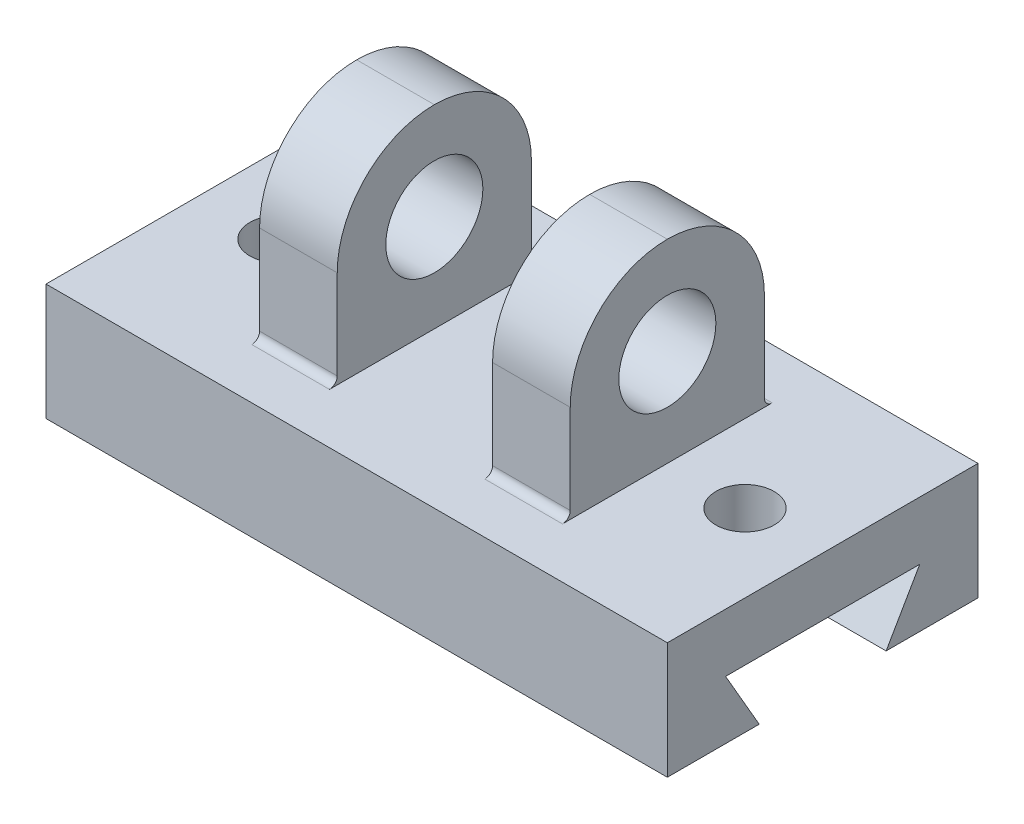
ISO-10303-21;
HEADER;
FILE_DESCRIPTION(('STEP AP214'),'2;1');
FILE_NAME('part.step','',(''),(''),'','','');
FILE_SCHEMA(('AUTOMOTIVE_DESIGN { 1 0 10303 214 1 1 1 1 }'));
ENDSEC;
DATA;
#1=APPLICATION_CONTEXT('core data for automotive mechanical design processes');
#2=APPLICATION_PROTOCOL_DEFINITION('international standard','automotive_design',2000,#1);
#3=PRODUCT_CONTEXT('',#1,'mechanical');
#4=PRODUCT('Part','Part','',(#3));
#5=PRODUCT_RELATED_PRODUCT_CATEGORY('part','',(#4));
#6=PRODUCT_DEFINITION_FORMATION('','',#4);
#7=PRODUCT_DEFINITION_CONTEXT('part definition',#1,'design');
#8=PRODUCT_DEFINITION('design','',#6,#7);
#9=PRODUCT_DEFINITION_SHAPE('','',#8);
#10=(LENGTH_UNIT() NAMED_UNIT(*) SI_UNIT(.MILLI.,.METRE.));
#11=(NAMED_UNIT(*) PLANE_ANGLE_UNIT() SI_UNIT($,.RADIAN.));
#12=(NAMED_UNIT(*) SI_UNIT($,.STERADIAN.) SOLID_ANGLE_UNIT());
#13=UNCERTAINTY_MEASURE_WITH_UNIT(LENGTH_MEASURE(1.E-05),#10,'distance_accuracy_value','');
#14=(GEOMETRIC_REPRESENTATION_CONTEXT(3) GLOBAL_UNCERTAINTY_ASSIGNED_CONTEXT((#13)) GLOBAL_UNIT_ASSIGNED_CONTEXT((#10,
#11,#12)) REPRESENTATION_CONTEXT('',''));
#15=CARTESIAN_POINT('',(0.,0.,0.));
#16=DIRECTION('',(0.,0.,1.));
#17=DIRECTION('',(1.,0.,0.));
#18=AXIS2_PLACEMENT_3D('',#15,#16,#17);
#19=CARTESIAN_POINT('',(80.,0.,0.));
#20=DIRECTION('',(0.,-1.,0.));
#21=DIRECTION('',(0.,0.,-1.));
#22=AXIS2_PLACEMENT_3D('',#19,#20,#21);
#23=PLANE('',#22);
#24=CARTESIAN_POINT('',(-60.,0.,40.));
#25=DIRECTION('',(0.,-1.,0.));
#26=DIRECTION('',(0.,0.,1.));
#27=AXIS2_PLACEMENT_3D('',#24,#25,#26);
#28=CIRCLE('',#27,7.50000000000001);
#29=CARTESIAN_POINT('',(-60.,0.,47.5));
#30=VERTEX_POINT('',#29);
#31=EDGE_CURVE('E353',#30,#30,#28,.T.);
#32=ORIENTED_EDGE('',*,*,#31,.T.);
#33=EDGE_LOOP('',(#32));
#34=FACE_BOUND('',#33,.T.);
#35=DIRECTION('',(1.,0.,0.));
#36=VECTOR('',#35,1.);
#37=CARTESIAN_POINT('',(80.,0.,13.));
#38=LINE('',#37,#36);
#39=CARTESIAN_POINT('',(-40.,0.,13.));
#40=VERTEX_POINT('',#39);
#41=CARTESIAN_POINT('',(-20.,0.,13.));
#42=VERTEX_POINT('',#41);
#43=EDGE_CURVE('E363',#40,#42,#38,.T.);
#44=ORIENTED_EDGE('',*,*,#43,.T.);
#45=DIRECTION('',(0.,0.,1.));
#46=VECTOR('',#45,1.);
#47=CARTESIAN_POINT('',(-20.,0.,65.));
#48=LINE('',#47,#46);
#49=CARTESIAN_POINT('',(-20.,0.,67.));
#50=VERTEX_POINT('',#49);
#51=EDGE_CURVE('E369',#42,#50,#48,.T.);
#52=ORIENTED_EDGE('',*,*,#51,.T.);
#53=DIRECTION('',(-1.,0.,0.));
#54=VECTOR('',#53,1.);
#55=CARTESIAN_POINT('',(80.,0.,67.));
#56=LINE('',#55,#54);
#57=CARTESIAN_POINT('',(-40.,0.,67.));
#58=VERTEX_POINT('',#57);
#59=EDGE_CURVE('E341',#50,#58,#56,.T.);
#60=ORIENTED_EDGE('',*,*,#59,.T.);
#61=DIRECTION('',(0.,0.,-1.));
#62=VECTOR('',#61,1.);
#63=CARTESIAN_POINT('',(-40.,0.,15.));
#64=LINE('',#63,#62);
#65=EDGE_CURVE('E345',#58,#40,#64,.T.);
#66=ORIENTED_EDGE('',*,*,#65,.T.);
#67=EDGE_LOOP('',(#44,#52,#60,#66));
#68=FACE_BOUND('',#67,.T.);
#69=CARTESIAN_POINT('',(60.,0.,40.));
#70=DIRECTION('',(0.,1.,0.));
#71=DIRECTION('',(0.,0.,1.));
#72=AXIS2_PLACEMENT_3D('',#69,#70,#71);
#73=CIRCLE('',#72,7.50000000000001);
#74=CARTESIAN_POINT('',(60.,0.,47.5));
#75=VERTEX_POINT('',#74);
#76=EDGE_CURVE('E235',#75,#75,#73,.T.);
#77=ORIENTED_EDGE('',*,*,#76,.F.);
#78=EDGE_LOOP('',(#77));
#79=FACE_BOUND('',#78,.T.);
#80=DIRECTION('',(-1.,0.,0.));
#81=VECTOR('',#80,1.);
#82=CARTESIAN_POINT('',(80.,0.,0.));
#83=LINE('',#82,#81);
#84=CARTESIAN_POINT('',(80.,0.,0.));
#85=VERTEX_POINT('',#84);
#86=CARTESIAN_POINT('',(-80.,0.,0.));
#87=VERTEX_POINT('',#86);
#88=EDGE_CURVE('E287',#85,#87,#83,.T.);
#89=ORIENTED_EDGE('',*,*,#88,.T.);
#90=DIRECTION('',(0.,0.,1.));
#91=VECTOR('',#90,1.);
#92=CARTESIAN_POINT('',(-80.,0.,0.));
#93=LINE('',#92,#91);
#94=CARTESIAN_POINT('',(-80.,0.,80.));
#95=VERTEX_POINT('',#94);
#96=EDGE_CURVE('E212',#87,#95,#93,.T.);
#97=ORIENTED_EDGE('',*,*,#96,.T.);
#98=DIRECTION('',(-1.,0.,0.));
#99=VECTOR('',#98,1.);
#100=CARTESIAN_POINT('',(80.,0.,80.));
#101=LINE('',#100,#99);
#102=CARTESIAN_POINT('',(80.,0.,80.));
#103=VERTEX_POINT('',#102);
#104=EDGE_CURVE('E285',#103,#95,#101,.T.);
#105=ORIENTED_EDGE('',*,*,#104,.F.);
#106=DIRECTION('',(0.,0.,1.));
#107=VECTOR('',#106,1.);
#108=CARTESIAN_POINT('',(80.,0.,0.));
#109=LINE('',#108,#107);
#110=EDGE_CURVE('E263',#85,#103,#109,.T.);
#111=ORIENTED_EDGE('',*,*,#110,.F.);
#112=EDGE_LOOP('',(#89,#97,#105,#111));
#113=FACE_BOUND('',#112,.T.);
#114=DIRECTION('',(0.,0.,1.));
#115=VECTOR('',#114,1.);
#116=CARTESIAN_POINT('',(20.,0.,65.));
#117=LINE('',#116,#115);
#118=CARTESIAN_POINT('',(20.,0.,13.));
#119=VERTEX_POINT('',#118);
#120=CARTESIAN_POINT('',(20.,0.,67.));
#121=VERTEX_POINT('',#120);
#122=EDGE_CURVE('E246',#119,#121,#117,.T.);
#123=ORIENTED_EDGE('',*,*,#122,.F.);
#124=DIRECTION('',(-1.,0.,0.));
#125=VECTOR('',#124,1.);
#126=CARTESIAN_POINT('',(40.,0.,13.));
#127=LINE('',#126,#125);
#128=CARTESIAN_POINT('',(40.,0.,13.));
#129=VERTEX_POINT('',#128);
#130=EDGE_CURVE('E320',#119,#129,#127,.F.);
#131=ORIENTED_EDGE('',*,*,#130,.T.);
#132=DIRECTION('',(0.,0.,-1.));
#133=VECTOR('',#132,1.);
#134=CARTESIAN_POINT('',(40.,0.,15.));
#135=LINE('',#134,#133);
#136=CARTESIAN_POINT('',(40.,0.,67.));
#137=VERTEX_POINT('',#136);
#138=EDGE_CURVE('E248',#137,#129,#135,.T.);
#139=ORIENTED_EDGE('',*,*,#138,.F.);
#140=DIRECTION('',(1.,0.,0.));
#141=VECTOR('',#140,1.);
#142=CARTESIAN_POINT('',(20.,0.,67.));
#143=LINE('',#142,#141);
#144=EDGE_CURVE('E309',#137,#121,#143,.F.);
#145=ORIENTED_EDGE('',*,*,#144,.T.);
#146=EDGE_LOOP('',(#123,#131,#139,#145));
#147=FACE_BOUND('',#146,.T.);
#148=ADVANCED_FACE('F39',(#34,#68,#79,#113,#147),#23,.F.);
#149=CARTESIAN_POINT('',(80.,-30.,0.));
#150=DIRECTION('',(0.,0.,1.));
#151=DIRECTION('',(1.,0.,0.));
#152=AXIS2_PLACEMENT_3D('',#149,#150,#151);
#153=PLANE('',#152);
#154=DIRECTION('',(-1.,0.,0.));
#155=VECTOR('',#154,1.);
#156=CARTESIAN_POINT('',(80.,-30.,0.));
#157=LINE('',#156,#155);
#158=CARTESIAN_POINT('',(80.,-30.,0.));
#159=VERTEX_POINT('',#158);
#160=CARTESIAN_POINT('',(-80.,-30.,0.));
#161=VERTEX_POINT('',#160);
#162=EDGE_CURVE('E190',#159,#161,#157,.T.);
#163=ORIENTED_EDGE('',*,*,#162,.T.);
#164=DIRECTION('',(0.,1.,0.));
#165=VECTOR('',#164,1.);
#166=CARTESIAN_POINT('',(-80.,-30.,0.));
#167=LINE('',#166,#165);
#168=EDGE_CURVE('E194',#161,#87,#167,.T.);
#169=ORIENTED_EDGE('',*,*,#168,.T.);
#170=ORIENTED_EDGE('',*,*,#88,.F.);
#171=DIRECTION('',(0.,1.,0.));
#172=VECTOR('',#171,1.);
#173=CARTESIAN_POINT('',(80.,-30.,0.));
#174=LINE('',#173,#172);
#175=EDGE_CURVE('E197',#159,#85,#174,.T.);
#176=ORIENTED_EDGE('',*,*,#175,.F.);
#177=EDGE_LOOP('',(#163,#169,#170,#176));
#178=FACE_BOUND('',#177,.T.);
#179=ADVANCED_FACE('F192',(#178),#153,.F.);
#180=CARTESIAN_POINT('',(80.,0.,80.));
#181=DIRECTION('',(0.,0.,-1.));
#182=DIRECTION('',(-1.,0.,0.));
#183=AXIS2_PLACEMENT_3D('',#180,#181,#182);
#184=PLANE('',#183);
#185=ORIENTED_EDGE('',*,*,#104,.T.);
#186=DIRECTION('',(0.,-1.,0.));
#187=VECTOR('',#186,1.);
#188=CARTESIAN_POINT('',(-80.,0.,80.));
#189=LINE('',#188,#187);
#190=CARTESIAN_POINT('',(-80.,-30.,80.));
#191=VERTEX_POINT('',#190);
#192=EDGE_CURVE('E231',#95,#191,#189,.T.);
#193=ORIENTED_EDGE('',*,*,#192,.T.);
#194=DIRECTION('',(-1.,0.,0.));
#195=VECTOR('',#194,1.);
#196=CARTESIAN_POINT('',(80.,-30.,80.));
#197=LINE('',#196,#195);
#198=CARTESIAN_POINT('',(80.,-30.,80.));
#199=VERTEX_POINT('',#198);
#200=EDGE_CURVE('E283',#199,#191,#197,.T.);
#201=ORIENTED_EDGE('',*,*,#200,.F.);
#202=DIRECTION('',(0.,-1.,0.));
#203=VECTOR('',#202,1.);
#204=CARTESIAN_POINT('',(80.,0.,80.));
#205=LINE('',#204,#203);
#206=EDGE_CURVE('E265',#103,#199,#205,.T.);
#207=ORIENTED_EDGE('',*,*,#206,.F.);
#208=EDGE_LOOP('',(#185,#193,#201,#207));
#209=FACE_BOUND('',#208,.T.);
#210=ADVANCED_FACE('F425',(#209),#184,.F.);
#211=CARTESIAN_POINT('',(80.,-30.,80.));
#212=DIRECTION('',(0.,1.,0.));
#213=DIRECTION('',(0.,0.,1.));
#214=AXIS2_PLACEMENT_3D('',#211,#212,#213);
#215=PLANE('',#214);
#216=ORIENTED_EDGE('',*,*,#200,.T.);
#217=DIRECTION('',(0.,0.,-1.));
#218=VECTOR('',#217,1.);
#219=CARTESIAN_POINT('',(-80.,-30.,80.));
#220=LINE('',#219,#218);
#221=CARTESIAN_POINT('',(-80.,-30.,56.3397459621555));
#222=VERTEX_POINT('',#221);
#223=EDGE_CURVE('E228',#191,#222,#220,.T.);
#224=ORIENTED_EDGE('',*,*,#223,.T.);
#225=DIRECTION('',(-1.,0.,0.));
#226=VECTOR('',#225,1.);
#227=CARTESIAN_POINT('',(80.,-30.,56.3397459621555));
#228=LINE('',#227,#226);
#229=CARTESIAN_POINT('',(80.,-30.,56.3397459621555));
#230=VERTEX_POINT('',#229);
#231=EDGE_CURVE('E281',#230,#222,#228,.T.);
#232=ORIENTED_EDGE('',*,*,#231,.F.);
#233=DIRECTION('',(0.,0.,-1.));
#234=VECTOR('',#233,1.);
#235=CARTESIAN_POINT('',(80.,-30.,80.));
#236=LINE('',#235,#234);
#237=EDGE_CURVE('E267',#199,#230,#236,.T.);
#238=ORIENTED_EDGE('',*,*,#237,.F.);
#239=EDGE_LOOP('',(#216,#224,#232,#238));
#240=FACE_BOUND('',#239,.T.);
#241=ADVANCED_FACE('F422',(#240),#215,.F.);
#242=CARTESIAN_POINT('',(80.,-30.,56.3397459621555));
#243=DIRECTION('',(0.,-0.500000000000004,0.866025403784436));
#244=DIRECTION('',(0.,-0.866025403784436,-0.500000000000004));
#245=AXIS2_PLACEMENT_3D('',#242,#243,#244);
#246=PLANE('',#245);
#247=ORIENTED_EDGE('',*,*,#231,.T.);
#248=DIRECTION('',(0.,0.866025403784436,0.500000000000004));
#249=VECTOR('',#248,1.);
#250=CARTESIAN_POINT('',(-80.,-30.,56.3397459621555));
#251=LINE('',#250,#249);
#252=CARTESIAN_POINT('',(-80.,-15.,65.));
#253=VERTEX_POINT('',#252);
#254=EDGE_CURVE('E225',#222,#253,#251,.T.);
#255=ORIENTED_EDGE('',*,*,#254,.T.);
#256=DIRECTION('',(-1.,0.,0.));
#257=VECTOR('',#256,1.);
#258=CARTESIAN_POINT('',(80.,-15.,65.));
#259=LINE('',#258,#257);
#260=CARTESIAN_POINT('',(80.,-15.,65.));
#261=VERTEX_POINT('',#260);
#262=EDGE_CURVE('E279',#261,#253,#259,.T.);
#263=ORIENTED_EDGE('',*,*,#262,.F.);
#264=DIRECTION('',(0.,0.866025403784436,0.500000000000004));
#265=VECTOR('',#264,1.);
#266=CARTESIAN_POINT('',(80.,-30.,56.3397459621555));
#267=LINE('',#266,#265);
#268=EDGE_CURVE('E269',#230,#261,#267,.T.);
#269=ORIENTED_EDGE('',*,*,#268,.F.);
#270=EDGE_LOOP('',(#247,#255,#263,#269));
#271=FACE_BOUND('',#270,.T.);
#272=ADVANCED_FACE('F407',(#271),#246,.F.);
#273=CARTESIAN_POINT('',(80.,-15.,65.));
#274=DIRECTION('',(0.,1.,0.));
#275=DIRECTION('',(0.,0.,1.));
#276=AXIS2_PLACEMENT_3D('',#273,#274,#275);
#277=PLANE('',#276);
#278=CARTESIAN_POINT('',(-60.,-15.,40.));
#279=DIRECTION('',(0.,1.,0.));
#280=DIRECTION('',(0.,0.,1.));
#281=AXIS2_PLACEMENT_3D('',#278,#279,#280);
#282=CIRCLE('',#281,7.50000000000001);
#283=CARTESIAN_POINT('',(-60.,-15.,47.5));
#284=VERTEX_POINT('',#283);
#285=EDGE_CURVE('E350',#284,#284,#282,.F.);
#286=ORIENTED_EDGE('',*,*,#285,.F.);
#287=EDGE_LOOP('',(#286));
#288=FACE_BOUND('',#287,.T.);
#289=CARTESIAN_POINT('',(60.,-15.,40.));
#290=DIRECTION('',(0.,1.,0.));
#291=DIRECTION('',(0.,0.,1.));
#292=AXIS2_PLACEMENT_3D('',#289,#290,#291);
#293=CIRCLE('',#292,7.50000000000001);
#294=CARTESIAN_POINT('',(60.,-15.,47.5));
#295=VERTEX_POINT('',#294);
#296=EDGE_CURVE('E238',#295,#295,#293,.T.);
#297=ORIENTED_EDGE('',*,*,#296,.T.);
#298=EDGE_LOOP('',(#297));
#299=FACE_BOUND('',#298,.T.);
#300=ORIENTED_EDGE('',*,*,#262,.T.);
#301=DIRECTION('',(0.,0.,-1.));
#302=VECTOR('',#301,1.);
#303=CARTESIAN_POINT('',(-80.,-15.,65.));
#304=LINE('',#303,#302);
#305=CARTESIAN_POINT('',(-80.,-15.,15.));
#306=VERTEX_POINT('',#305);
#307=EDGE_CURVE('E219',#253,#306,#304,.T.);
#308=ORIENTED_EDGE('',*,*,#307,.T.);
#309=DIRECTION('',(-1.,0.,0.));
#310=VECTOR('',#309,1.);
#311=CARTESIAN_POINT('',(80.,-15.,15.));
#312=LINE('',#311,#310);
#313=CARTESIAN_POINT('',(80.,-15.,15.));
#314=VERTEX_POINT('',#313);
#315=EDGE_CURVE('E277',#314,#306,#312,.T.);
#316=ORIENTED_EDGE('',*,*,#315,.F.);
#317=DIRECTION('',(0.,0.,-1.));
#318=VECTOR('',#317,1.);
#319=CARTESIAN_POINT('',(80.,-15.,65.));
#320=LINE('',#319,#318);
#321=EDGE_CURVE('E271',#261,#314,#320,.T.);
#322=ORIENTED_EDGE('',*,*,#321,.F.);
#323=EDGE_LOOP('',(#300,#308,#316,#322));
#324=FACE_BOUND('',#323,.T.);
#325=ADVANCED_FACE('F403',(#288,#299,#324),#277,.F.);
#326=CARTESIAN_POINT('',(80.,-15.,15.));
#327=DIRECTION('',(0.,-0.500000000000004,-0.866025403784436));
#328=DIRECTION('',(0.,0.866025403784436,-0.500000000000004));
#329=AXIS2_PLACEMENT_3D('',#326,#327,#328);
#330=PLANE('',#329);
#331=ORIENTED_EDGE('',*,*,#315,.T.);
#332=DIRECTION('',(0.,-0.866025403784436,0.500000000000004));
#333=VECTOR('',#332,1.);
#334=CARTESIAN_POINT('',(-80.,-15.,15.));
#335=LINE('',#334,#333);
#336=CARTESIAN_POINT('',(-80.,-30.,23.6602540378445));
#337=VERTEX_POINT('',#336);
#338=EDGE_CURVE('E217',#306,#337,#335,.T.);
#339=ORIENTED_EDGE('',*,*,#338,.T.);
#340=DIRECTION('',(-1.,0.,0.));
#341=VECTOR('',#340,1.);
#342=CARTESIAN_POINT('',(80.,-30.,23.6602540378445));
#343=LINE('',#342,#341);
#344=CARTESIAN_POINT('',(80.,-30.,23.6602540378445));
#345=VERTEX_POINT('',#344);
#346=EDGE_CURVE('E201',#345,#337,#343,.T.);
#347=ORIENTED_EDGE('',*,*,#346,.F.);
#348=DIRECTION('',(0.,-0.866025403784436,0.500000000000004));
#349=VECTOR('',#348,1.);
#350=CARTESIAN_POINT('',(80.,-15.,15.));
#351=LINE('',#350,#349);
#352=EDGE_CURVE('E273',#314,#345,#351,.T.);
#353=ORIENTED_EDGE('',*,*,#352,.F.);
#354=EDGE_LOOP('',(#331,#339,#347,#353));
#355=FACE_BOUND('',#354,.T.);
#356=ADVANCED_FACE('F406',(#355),#330,.F.);
#357=CARTESIAN_POINT('',(80.,-30.,23.6602540378445));
#358=DIRECTION('',(0.,1.,0.));
#359=DIRECTION('',(0.,0.,1.));
#360=AXIS2_PLACEMENT_3D('',#357,#358,#359);
#361=PLANE('',#360);
#362=ORIENTED_EDGE('',*,*,#346,.T.);
#363=DIRECTION('',(0.,0.,-1.));
#364=VECTOR('',#363,1.);
#365=CARTESIAN_POINT('',(-80.,-30.,23.6602540378445));
#366=LINE('',#365,#364);
#367=EDGE_CURVE('E208',#337,#161,#366,.T.);
#368=ORIENTED_EDGE('',*,*,#367,.T.);
#369=ORIENTED_EDGE('',*,*,#162,.F.);
#370=DIRECTION('',(0.,0.,-1.));
#371=VECTOR('',#370,1.);
#372=CARTESIAN_POINT('',(80.,-30.,23.6602540378445));
#373=LINE('',#372,#371);
#374=EDGE_CURVE('E202',#345,#159,#373,.T.);
#375=ORIENTED_EDGE('',*,*,#374,.F.);
#376=EDGE_LOOP('',(#362,#368,#369,#375));
#377=FACE_BOUND('',#376,.T.);
#378=ADVANCED_FACE('F215',(#377),#361,.F.);
#379=CARTESIAN_POINT('',(80.,0.,0.));
#380=DIRECTION('',(1.,0.,0.));
#381=DIRECTION('',(0.,0.,-1.));
#382=AXIS2_PLACEMENT_3D('',#379,#380,#381);
#383=PLANE('',#382);
#384=ORIENTED_EDGE('',*,*,#175,.T.);
#385=ORIENTED_EDGE('',*,*,#110,.T.);
#386=ORIENTED_EDGE('',*,*,#206,.T.);
#387=ORIENTED_EDGE('',*,*,#237,.T.);
#388=ORIENTED_EDGE('',*,*,#268,.T.);
#389=ORIENTED_EDGE('',*,*,#321,.T.);
#390=ORIENTED_EDGE('',*,*,#352,.T.);
#391=ORIENTED_EDGE('',*,*,#374,.T.);
#392=EDGE_LOOP('',(#384,#385,#386,#387,#388,#389,#390,#391));
#393=FACE_BOUND('',#392,.T.);
#394=ADVANCED_FACE('F431',(#393),#383,.T.);
#395=CARTESIAN_POINT('',(20.,50.,15.));
#396=DIRECTION('',(0.,0.,1.));
#397=DIRECTION('',(1.,0.,0.));
#398=AXIS2_PLACEMENT_3D('',#395,#396,#397);
#399=PLANE('',#398);
#400=DIRECTION('',(0.,-1.,0.));
#401=VECTOR('',#400,1.);
#402=CARTESIAN_POINT('',(40.,50.,15.));
#403=LINE('',#402,#401);
#404=CARTESIAN_POINT('',(40.,25.,15.));
#405=VERTEX_POINT('',#404);
#406=CARTESIAN_POINT('',(40.,2.,15.));
#407=VERTEX_POINT('',#406);
#408=EDGE_CURVE('E250',#405,#407,#403,.T.);
#409=ORIENTED_EDGE('',*,*,#408,.T.);
#410=DIRECTION('',(-1.,0.,0.));
#411=VECTOR('',#410,1.);
#412=CARTESIAN_POINT('',(20.,2.,15.));
#413=LINE('',#412,#411);
#414=CARTESIAN_POINT('',(20.,2.,15.));
#415=VERTEX_POINT('',#414);
#416=EDGE_CURVE('E317',#407,#415,#413,.T.);
#417=ORIENTED_EDGE('',*,*,#416,.T.);
#418=DIRECTION('',(0.,-1.,0.));
#419=VECTOR('',#418,1.);
#420=CARTESIAN_POINT('',(20.,50.,15.));
#421=LINE('',#420,#419);
#422=CARTESIAN_POINT('',(20.,25.,15.));
#423=VERTEX_POINT('',#422);
#424=EDGE_CURVE('E259',#423,#415,#421,.T.);
#425=ORIENTED_EDGE('',*,*,#424,.F.);
#426=DIRECTION('',(-1.,0.,0.));
#427=VECTOR('',#426,1.);
#428=CARTESIAN_POINT('',(20.,25.,15.));
#429=LINE('',#428,#427);
#430=EDGE_CURVE('E300',#423,#405,#429,.F.);
#431=ORIENTED_EDGE('',*,*,#430,.T.);
#432=EDGE_LOOP('',(#409,#417,#425,#431));
#433=FACE_BOUND('',#432,.T.);
#434=ADVANCED_FACE('F519',(#433),#399,.F.);
#435=CARTESIAN_POINT('',(20.,50.,65.));
#436=DIRECTION('',(1.,0.,0.));
#437=DIRECTION('',(0.,0.,-1.));
#438=AXIS2_PLACEMENT_3D('',#435,#436,#437);
#439=PLANE('',#438);
#440=CARTESIAN_POINT('',(20.,25.,40.));
#441=DIRECTION('',(1.,0.,0.));
#442=DIRECTION('',(0.,0.,-1.));
#443=AXIS2_PLACEMENT_3D('',#440,#441,#442);
#444=CIRCLE('',#443,12.5);
#445=CARTESIAN_POINT('',(20.,25.,27.5));
#446=VERTEX_POINT('',#445);
#447=EDGE_CURVE('E242',#446,#446,#444,.T.);
#448=ORIENTED_EDGE('',*,*,#447,.T.);
#449=EDGE_LOOP('',(#448));
#450=FACE_BOUND('',#449,.T.);
#451=DIRECTION('',(0.,-1.,0.));
#452=VECTOR('',#451,1.);
#453=CARTESIAN_POINT('',(20.,50.,65.));
#454=LINE('',#453,#452);
#455=CARTESIAN_POINT('',(20.,25.,65.));
#456=VERTEX_POINT('',#455);
#457=CARTESIAN_POINT('',(20.,2.,65.));
#458=VERTEX_POINT('',#457);
#459=EDGE_CURVE('E256',#456,#458,#454,.T.);
#460=ORIENTED_EDGE('',*,*,#459,.F.);
#461=CARTESIAN_POINT('',(20.,25.,40.));
#462=DIRECTION('',(1.,0.,0.));
#463=DIRECTION('',(0.,0.,-1.));
#464=AXIS2_PLACEMENT_3D('',#461,#462,#463);
#465=CIRCLE('',#464,25.);
#466=CARTESIAN_POINT('',(20.,50.,40.));
#467=VERTEX_POINT('',#466);
#468=EDGE_CURVE('E298',#456,#467,#465,.F.);
#469=ORIENTED_EDGE('',*,*,#468,.T.);
#470=CARTESIAN_POINT('',(20.,25.,40.));
#471=DIRECTION('',(1.,0.,0.));
#472=DIRECTION('',(0.,0.,-1.));
#473=AXIS2_PLACEMENT_3D('',#470,#471,#472);
#474=CIRCLE('',#473,25.);
#475=EDGE_CURVE('E296',#467,#423,#474,.F.);
#476=ORIENTED_EDGE('',*,*,#475,.T.);
#477=ORIENTED_EDGE('',*,*,#424,.T.);
#478=CARTESIAN_POINT('',(20.,2.,13.));
#479=DIRECTION('',(1.,0.,0.));
#480=DIRECTION('',(0.,0.,-1.));
#481=AXIS2_PLACEMENT_3D('',#478,#479,#480);
#482=CIRCLE('',#481,2.);
#483=EDGE_CURVE('E323',#415,#119,#482,.T.);
#484=ORIENTED_EDGE('',*,*,#483,.T.);
#485=ORIENTED_EDGE('',*,*,#122,.T.);
#486=CARTESIAN_POINT('',(20.,2.,67.));
#487=DIRECTION('',(1.,0.,0.));
#488=DIRECTION('',(0.,0.,-1.));
#489=AXIS2_PLACEMENT_3D('',#486,#487,#488);
#490=CIRCLE('',#489,2.);
#491=EDGE_CURVE('E315',#121,#458,#490,.T.);
#492=ORIENTED_EDGE('',*,*,#491,.T.);
#493=EDGE_LOOP('',(#460,#469,#476,#477,#484,#485,#492));
#494=FACE_BOUND('',#493,.T.);
#495=ADVANCED_FACE('F515',(#450,#494),#439,.F.);
#496=CARTESIAN_POINT('',(40.,50.,65.));
#497=DIRECTION('',(0.,0.,-1.));
#498=DIRECTION('',(-1.,0.,0.));
#499=AXIS2_PLACEMENT_3D('',#496,#497,#498);
#500=PLANE('',#499);
#501=ORIENTED_EDGE('',*,*,#459,.T.);
#502=DIRECTION('',(1.,0.,0.));
#503=VECTOR('',#502,1.);
#504=CARTESIAN_POINT('',(40.,2.,65.));
#505=LINE('',#504,#503);
#506=CARTESIAN_POINT('',(40.,2.,65.));
#507=VERTEX_POINT('',#506);
#508=EDGE_CURVE('E302',#458,#507,#505,.T.);
#509=ORIENTED_EDGE('',*,*,#508,.T.);
#510=DIRECTION('',(0.,-1.,0.));
#511=VECTOR('',#510,1.);
#512=CARTESIAN_POINT('',(40.,50.,65.));
#513=LINE('',#512,#511);
#514=CARTESIAN_POINT('',(40.,25.,65.));
#515=VERTEX_POINT('',#514);
#516=EDGE_CURVE('E253',#515,#507,#513,.T.);
#517=ORIENTED_EDGE('',*,*,#516,.F.);
#518=DIRECTION('',(1.,0.,0.));
#519=VECTOR('',#518,1.);
#520=CARTESIAN_POINT('',(40.,25.,65.));
#521=LINE('',#520,#519);
#522=EDGE_CURVE('E293',#515,#456,#521,.F.);
#523=ORIENTED_EDGE('',*,*,#522,.T.);
#524=EDGE_LOOP('',(#501,#509,#517,#523));
#525=FACE_BOUND('',#524,.T.);
#526=ADVANCED_FACE('F511',(#525),#500,.F.);
#527=CARTESIAN_POINT('',(40.,50.,15.));
#528=DIRECTION('',(-1.,0.,0.));
#529=DIRECTION('',(0.,0.,1.));
#530=AXIS2_PLACEMENT_3D('',#527,#528,#529);
#531=PLANE('',#530);
#532=CARTESIAN_POINT('',(40.,25.,40.));
#533=DIRECTION('',(1.,0.,0.));
#534=DIRECTION('',(0.,0.,-1.));
#535=AXIS2_PLACEMENT_3D('',#532,#533,#534);
#536=CIRCLE('',#535,12.5);
#537=CARTESIAN_POINT('',(40.,25.,27.5));
#538=VERTEX_POINT('',#537);
#539=EDGE_CURVE('E239',#538,#538,#536,.T.);
#540=ORIENTED_EDGE('',*,*,#539,.F.);
#541=EDGE_LOOP('',(#540));
#542=FACE_BOUND('',#541,.T.);
#543=CARTESIAN_POINT('',(40.,25.,40.));
#544=DIRECTION('',(-1.,0.,0.));
#545=DIRECTION('',(0.,0.,1.));
#546=AXIS2_PLACEMENT_3D('',#543,#544,#545);
#547=CIRCLE('',#546,25.);
#548=CARTESIAN_POINT('',(40.,50.,40.));
#549=VERTEX_POINT('',#548);
#550=EDGE_CURVE('E289',#405,#549,#547,.F.);
#551=ORIENTED_EDGE('',*,*,#550,.T.);
#552=CARTESIAN_POINT('',(40.,25.,40.));
#553=DIRECTION('',(-1.,0.,0.));
#554=DIRECTION('',(0.,0.,1.));
#555=AXIS2_PLACEMENT_3D('',#552,#553,#554);
#556=CIRCLE('',#555,25.);
#557=EDGE_CURVE('E291',#549,#515,#556,.F.);
#558=ORIENTED_EDGE('',*,*,#557,.T.);
#559=ORIENTED_EDGE('',*,*,#516,.T.);
#560=CARTESIAN_POINT('',(40.,2.,67.));
#561=DIRECTION('',(-1.,0.,0.));
#562=DIRECTION('',(0.,0.,1.));
#563=AXIS2_PLACEMENT_3D('',#560,#561,#562);
#564=CIRCLE('',#563,2.);
#565=EDGE_CURVE('E312',#507,#137,#564,.T.);
#566=ORIENTED_EDGE('',*,*,#565,.T.);
#567=ORIENTED_EDGE('',*,*,#138,.T.);
#568=CARTESIAN_POINT('',(40.,2.,13.));
#569=DIRECTION('',(-1.,0.,0.));
#570=DIRECTION('',(0.,0.,1.));
#571=AXIS2_PLACEMENT_3D('',#568,#569,#570);
#572=CIRCLE('',#571,2.);
#573=EDGE_CURVE('E326',#129,#407,#572,.T.);
#574=ORIENTED_EDGE('',*,*,#573,.T.);
#575=ORIENTED_EDGE('',*,*,#408,.F.);
#576=EDGE_LOOP('',(#551,#558,#559,#566,#567,#574,#575));
#577=FACE_BOUND('',#576,.T.);
#578=ADVANCED_FACE('F458',(#542,#577),#531,.F.);
#579=CARTESIAN_POINT('',(0.,25.,40.));
#580=DIRECTION('',(-1.,0.,0.));
#581=DIRECTION('',(0.,0.,1.));
#582=AXIS2_PLACEMENT_3D('',#579,#580,#581);
#583=CYLINDRICAL_SURFACE('',#582,25.);
#584=ORIENTED_EDGE('',*,*,#430,.F.);
#585=ORIENTED_EDGE('',*,*,#475,.F.);
#586=DIRECTION('',(-1.,0.,0.));
#587=VECTOR('',#586,1.);
#588=CARTESIAN_POINT('',(0.,50.,40.));
#589=LINE('',#588,#587);
#590=EDGE_CURVE('E245',#549,#467,#589,.T.);
#591=ORIENTED_EDGE('',*,*,#590,.F.);
#592=ORIENTED_EDGE('',*,*,#550,.F.);
#593=EDGE_LOOP('',(#584,#585,#591,#592));
#594=FACE_BOUND('',#593,.T.);
#595=ADVANCED_FACE('F454',(#594),#583,.T.);
#596=CARTESIAN_POINT('',(0.,25.,40.));
#597=DIRECTION('',(1.,0.,0.));
#598=DIRECTION('',(0.,0.,-1.));
#599=AXIS2_PLACEMENT_3D('',#596,#597,#598);
#600=CYLINDRICAL_SURFACE('',#599,25.);
#601=ORIENTED_EDGE('',*,*,#468,.F.);
#602=ORIENTED_EDGE('',*,*,#522,.F.);
#603=ORIENTED_EDGE('',*,*,#557,.F.);
#604=ORIENTED_EDGE('',*,*,#590,.T.);
#605=EDGE_LOOP('',(#601,#602,#603,#604));
#606=FACE_BOUND('',#605,.T.);
#607=ADVANCED_FACE('F450',(#606),#600,.T.);
#608=CARTESIAN_POINT('',(-10.,25.,40.));
#609=DIRECTION('',(1.,0.,0.));
#610=DIRECTION('',(0.,0.,-1.));
#611=AXIS2_PLACEMENT_3D('',#608,#609,#610);
#612=CYLINDRICAL_SURFACE('',#611,12.5);
#613=ORIENTED_EDGE('',*,*,#539,.T.);
#614=EDGE_LOOP('',(#613));
#615=FACE_BOUND('',#614,.T.);
#616=ORIENTED_EDGE('',*,*,#447,.F.);
#617=EDGE_LOOP('',(#616));
#618=FACE_BOUND('',#617,.T.);
#619=ADVANCED_FACE('F453',(#615,#618),#612,.F.);
#620=CARTESIAN_POINT('',(60.,-50.,40.));
#621=DIRECTION('',(0.,1.,0.));
#622=DIRECTION('',(0.,0.,1.));
#623=AXIS2_PLACEMENT_3D('',#620,#621,#622);
#624=CYLINDRICAL_SURFACE('',#623,7.50000000000001);
#625=ORIENTED_EDGE('',*,*,#76,.T.);
#626=EDGE_LOOP('',(#625));
#627=FACE_BOUND('',#626,.T.);
#628=ORIENTED_EDGE('',*,*,#296,.F.);
#629=EDGE_LOOP('',(#628));
#630=FACE_BOUND('',#629,.T.);
#631=ADVANCED_FACE('F464',(#627,#630),#624,.F.);
#632=CARTESIAN_POINT('',(40.,2.,67.));
#633=DIRECTION('',(-1.,0.,0.));
#634=DIRECTION('',(0.,0.,1.));
#635=AXIS2_PLACEMENT_3D('',#632,#633,#634);
#636=CYLINDRICAL_SURFACE('',#635,2.);
#637=ORIENTED_EDGE('',*,*,#491,.F.);
#638=ORIENTED_EDGE('',*,*,#144,.F.);
#639=ORIENTED_EDGE('',*,*,#565,.F.);
#640=ORIENTED_EDGE('',*,*,#508,.F.);
#641=EDGE_LOOP('',(#637,#638,#639,#640));
#642=FACE_BOUND('',#641,.T.);
#643=ADVANCED_FACE('F460',(#642),#636,.F.);
#644=CARTESIAN_POINT('',(20.,2.,13.));
#645=DIRECTION('',(1.,0.,0.));
#646=DIRECTION('',(0.,0.,-1.));
#647=AXIS2_PLACEMENT_3D('',#644,#645,#646);
#648=CYLINDRICAL_SURFACE('',#647,2.);
#649=ORIENTED_EDGE('',*,*,#573,.F.);
#650=ORIENTED_EDGE('',*,*,#130,.F.);
#651=ORIENTED_EDGE('',*,*,#483,.F.);
#652=ORIENTED_EDGE('',*,*,#416,.F.);
#653=EDGE_LOOP('',(#649,#650,#651,#652));
#654=FACE_BOUND('',#653,.T.);
#655=ADVANCED_FACE('F463',(#654),#648,.F.);
#656=CARTESIAN_POINT('',(-80.,0.,0.));
#657=DIRECTION('',(-1.,0.,0.));
#658=DIRECTION('',(0.,0.,-1.));
#659=AXIS2_PLACEMENT_3D('',#656,#657,#658);
#660=PLANE('',#659);
#661=ORIENTED_EDGE('',*,*,#168,.F.);
#662=ORIENTED_EDGE('',*,*,#367,.F.);
#663=ORIENTED_EDGE('',*,*,#338,.F.);
#664=ORIENTED_EDGE('',*,*,#307,.F.);
#665=ORIENTED_EDGE('',*,*,#254,.F.);
#666=ORIENTED_EDGE('',*,*,#223,.F.);
#667=ORIENTED_EDGE('',*,*,#192,.F.);
#668=ORIENTED_EDGE('',*,*,#96,.F.);
#669=EDGE_LOOP('',(#661,#662,#663,#664,#665,#666,#667,#668));
#670=FACE_BOUND('',#669,.T.);
#671=ADVANCED_FACE('F206',(#670),#660,.T.);
#672=CARTESIAN_POINT('',(-20.,50.,15.));
#673=DIRECTION('',(0.,0.,-1.));
#674=DIRECTION('',(-1.,0.,0.));
#675=AXIS2_PLACEMENT_3D('',#672,#673,#674);
#676=PLANE('',#675);
#677=DIRECTION('',(0.,-1.,0.));
#678=VECTOR('',#677,1.);
#679=CARTESIAN_POINT('',(-20.,50.,15.));
#680=LINE('',#679,#678);
#681=CARTESIAN_POINT('',(-20.,25.,15.));
#682=VERTEX_POINT('',#681);
#683=CARTESIAN_POINT('',(-20.,2.,15.));
#684=VERTEX_POINT('',#683);
#685=EDGE_CURVE('E385',#682,#684,#680,.T.);
#686=ORIENTED_EDGE('',*,*,#685,.T.);
#687=DIRECTION('',(1.,0.,0.));
#688=VECTOR('',#687,1.);
#689=CARTESIAN_POINT('',(-20.,2.,15.));
#690=LINE('',#689,#688);
#691=CARTESIAN_POINT('',(-40.,2.,15.));
#692=VERTEX_POINT('',#691);
#693=EDGE_CURVE('E60',#684,#692,#690,.F.);
#694=ORIENTED_EDGE('',*,*,#693,.T.);
#695=DIRECTION('',(0.,-1.,0.));
#696=VECTOR('',#695,1.);
#697=CARTESIAN_POINT('',(-40.,50.,15.));
#698=LINE('',#697,#696);
#699=CARTESIAN_POINT('',(-40.,25.,15.));
#700=VERTEX_POINT('',#699);
#701=EDGE_CURVE('E213',#700,#692,#698,.T.);
#702=ORIENTED_EDGE('',*,*,#701,.F.);
#703=DIRECTION('',(1.,0.,0.));
#704=VECTOR('',#703,1.);
#705=CARTESIAN_POINT('',(-20.,25.,15.));
#706=LINE('',#705,#704);
#707=EDGE_CURVE('E339',#700,#682,#706,.T.);
#708=ORIENTED_EDGE('',*,*,#707,.T.);
#709=EDGE_LOOP('',(#686,#694,#702,#708));
#710=FACE_BOUND('',#709,.T.);
#711=ADVANCED_FACE('F491',(#710),#676,.T.);
#712=CARTESIAN_POINT('',(-40.,50.,15.));
#713=DIRECTION('',(-1.,0.,0.));
#714=DIRECTION('',(0.,0.,1.));
#715=AXIS2_PLACEMENT_3D('',#712,#713,#714);
#716=PLANE('',#715);
#717=CARTESIAN_POINT('',(-40.,25.,40.));
#718=DIRECTION('',(1.,0.,0.));
#719=DIRECTION('',(0.,0.,-1.));
#720=AXIS2_PLACEMENT_3D('',#717,#718,#719);
#721=CIRCLE('',#720,12.5);
#722=CARTESIAN_POINT('',(-40.,25.,27.5));
#723=VERTEX_POINT('',#722);
#724=EDGE_CURVE('E349',#723,#723,#721,.T.);
#725=ORIENTED_EDGE('',*,*,#724,.T.);
#726=EDGE_LOOP('',(#725));
#727=FACE_BOUND('',#726,.T.);
#728=DIRECTION('',(0.,-1.,0.));
#729=VECTOR('',#728,1.);
#730=CARTESIAN_POINT('',(-40.,50.,65.));
#731=LINE('',#730,#729);
#732=CARTESIAN_POINT('',(-40.,25.,65.));
#733=VERTEX_POINT('',#732);
#734=CARTESIAN_POINT('',(-40.,2.,65.));
#735=VERTEX_POINT('',#734);
#736=EDGE_CURVE('E378',#733,#735,#731,.T.);
#737=ORIENTED_EDGE('',*,*,#736,.F.);
#738=CARTESIAN_POINT('',(-40.,25.,40.));
#739=DIRECTION('',(-1.,0.,0.));
#740=DIRECTION('',(0.,0.,1.));
#741=AXIS2_PLACEMENT_3D('',#738,#739,#740);
#742=CIRCLE('',#741,25.);
#743=CARTESIAN_POINT('',(-40.,50.,40.));
#744=VERTEX_POINT('',#743);
#745=EDGE_CURVE('E333',#733,#744,#742,.T.);
#746=ORIENTED_EDGE('',*,*,#745,.T.);
#747=CARTESIAN_POINT('',(-40.,25.,40.));
#748=DIRECTION('',(-1.,0.,0.));
#749=DIRECTION('',(0.,0.,1.));
#750=AXIS2_PLACEMENT_3D('',#747,#748,#749);
#751=CIRCLE('',#750,25.);
#752=EDGE_CURVE('E331',#744,#700,#751,.T.);
#753=ORIENTED_EDGE('',*,*,#752,.T.);
#754=ORIENTED_EDGE('',*,*,#701,.T.);
#755=CARTESIAN_POINT('',(-40.,2.,13.));
#756=DIRECTION('',(-1.,0.,0.));
#757=DIRECTION('',(0.,0.,1.));
#758=AXIS2_PLACEMENT_3D('',#755,#756,#757);
#759=CIRCLE('',#758,2.);
#760=EDGE_CURVE('E11',#692,#40,#759,.F.);
#761=ORIENTED_EDGE('',*,*,#760,.T.);
#762=ORIENTED_EDGE('',*,*,#65,.F.);
#763=CARTESIAN_POINT('',(-40.,2.,67.));
#764=DIRECTION('',(-1.,0.,0.));
#765=DIRECTION('',(0.,0.,1.));
#766=AXIS2_PLACEMENT_3D('',#763,#764,#765);
#767=CIRCLE('',#766,2.);
#768=EDGE_CURVE('E358',#58,#735,#767,.F.);
#769=ORIENTED_EDGE('',*,*,#768,.T.);
#770=EDGE_LOOP('',(#737,#746,#753,#754,#761,#762,#769));
#771=FACE_BOUND('',#770,.T.);
#772=ADVANCED_FACE('F374',(#727,#771),#716,.T.);
#773=CARTESIAN_POINT('',(-40.,50.,65.));
#774=DIRECTION('',(0.,0.,1.));
#775=DIRECTION('',(1.,0.,0.));
#776=AXIS2_PLACEMENT_3D('',#773,#774,#775);
#777=PLANE('',#776);
#778=ORIENTED_EDGE('',*,*,#736,.T.);
#779=DIRECTION('',(-1.,0.,0.));
#780=VECTOR('',#779,1.);
#781=CARTESIAN_POINT('',(-40.,2.,65.));
#782=LINE('',#781,#780);
#783=CARTESIAN_POINT('',(-20.,2.,65.));
#784=VERTEX_POINT('',#783);
#785=EDGE_CURVE('E356',#735,#784,#782,.F.);
#786=ORIENTED_EDGE('',*,*,#785,.T.);
#787=DIRECTION('',(0.,-1.,0.));
#788=VECTOR('',#787,1.);
#789=CARTESIAN_POINT('',(-20.,50.,65.));
#790=LINE('',#789,#788);
#791=CARTESIAN_POINT('',(-20.,25.,65.));
#792=VERTEX_POINT('',#791);
#793=EDGE_CURVE('E380',#792,#784,#790,.T.);
#794=ORIENTED_EDGE('',*,*,#793,.F.);
#795=DIRECTION('',(-1.,0.,0.));
#796=VECTOR('',#795,1.);
#797=CARTESIAN_POINT('',(-40.,25.,65.));
#798=LINE('',#797,#796);
#799=EDGE_CURVE('E328',#792,#733,#798,.T.);
#800=ORIENTED_EDGE('',*,*,#799,.T.);
#801=EDGE_LOOP('',(#778,#786,#794,#800));
#802=FACE_BOUND('',#801,.T.);
#803=ADVANCED_FACE('F488',(#802),#777,.T.);
#804=CARTESIAN_POINT('',(-20.,50.,65.));
#805=DIRECTION('',(1.,0.,0.));
#806=DIRECTION('',(0.,0.,-1.));
#807=AXIS2_PLACEMENT_3D('',#804,#805,#806);
#808=PLANE('',#807);
#809=CARTESIAN_POINT('',(-20.,25.,40.));
#810=DIRECTION('',(1.,0.,0.));
#811=DIRECTION('',(0.,0.,-1.));
#812=AXIS2_PLACEMENT_3D('',#809,#810,#811);
#813=CIRCLE('',#812,12.5);
#814=CARTESIAN_POINT('',(-20.,25.,27.5));
#815=VERTEX_POINT('',#814);
#816=EDGE_CURVE('E346',#815,#815,#813,.F.);
#817=ORIENTED_EDGE('',*,*,#816,.T.);
#818=EDGE_LOOP('',(#817));
#819=FACE_BOUND('',#818,.T.);
#820=CARTESIAN_POINT('',(-20.,25.,40.));
#821=DIRECTION('',(1.,0.,0.));
#822=DIRECTION('',(0.,0.,-1.));
#823=AXIS2_PLACEMENT_3D('',#820,#821,#822);
#824=CIRCLE('',#823,25.);
#825=CARTESIAN_POINT('',(-20.,50.,40.));
#826=VERTEX_POINT('',#825);
#827=EDGE_CURVE('E335',#682,#826,#824,.T.);
#828=ORIENTED_EDGE('',*,*,#827,.T.);
#829=CARTESIAN_POINT('',(-20.,25.,40.));
#830=DIRECTION('',(1.,0.,0.));
#831=DIRECTION('',(0.,0.,-1.));
#832=AXIS2_PLACEMENT_3D('',#829,#830,#831);
#833=CIRCLE('',#832,25.);
#834=EDGE_CURVE('E337',#826,#792,#833,.T.);
#835=ORIENTED_EDGE('',*,*,#834,.T.);
#836=ORIENTED_EDGE('',*,*,#793,.T.);
#837=CARTESIAN_POINT('',(-20.,2.,67.));
#838=DIRECTION('',(1.,0.,0.));
#839=DIRECTION('',(0.,0.,-1.));
#840=AXIS2_PLACEMENT_3D('',#837,#838,#839);
#841=CIRCLE('',#840,2.);
#842=EDGE_CURVE('E360',#784,#50,#841,.F.);
#843=ORIENTED_EDGE('',*,*,#842,.T.);
#844=ORIENTED_EDGE('',*,*,#51,.F.);
#845=CARTESIAN_POINT('',(-20.,2.,13.));
#846=DIRECTION('',(1.,0.,0.));
#847=DIRECTION('',(0.,0.,-1.));
#848=AXIS2_PLACEMENT_3D('',#845,#846,#847);
#849=CIRCLE('',#848,2.);
#850=EDGE_CURVE('E47',#42,#684,#849,.F.);
#851=ORIENTED_EDGE('',*,*,#850,.T.);
#852=ORIENTED_EDGE('',*,*,#685,.F.);
#853=EDGE_LOOP('',(#828,#835,#836,#843,#844,#851,#852));
#854=FACE_BOUND('',#853,.T.);
#855=ADVANCED_FACE('F474',(#819,#854),#808,.T.);
#856=CARTESIAN_POINT('',(-20.,25.,40.));
#857=DIRECTION('',(-1.,0.,0.));
#858=DIRECTION('',(0.,0.,1.));
#859=AXIS2_PLACEMENT_3D('',#856,#857,#858);
#860=CYLINDRICAL_SURFACE('',#859,25.);
#861=DIRECTION('',(1.,0.,0.));
#862=VECTOR('',#861,1.);
#863=CARTESIAN_POINT('',(-40.,50.,40.));
#864=LINE('',#863,#862);
#865=EDGE_CURVE('E342',#826,#744,#864,.F.);
#866=ORIENTED_EDGE('',*,*,#865,.F.);
#867=ORIENTED_EDGE('',*,*,#827,.F.);
#868=ORIENTED_EDGE('',*,*,#707,.F.);
#869=ORIENTED_EDGE('',*,*,#752,.F.);
#870=EDGE_LOOP('',(#866,#867,#868,#869));
#871=FACE_BOUND('',#870,.T.);
#872=ADVANCED_FACE('F471',(#871),#860,.T.);
#873=CARTESIAN_POINT('',(-40.,25.,40.));
#874=DIRECTION('',(1.,0.,0.));
#875=DIRECTION('',(0.,0.,-1.));
#876=AXIS2_PLACEMENT_3D('',#873,#874,#875);
#877=CYLINDRICAL_SURFACE('',#876,25.);
#878=ORIENTED_EDGE('',*,*,#834,.F.);
#879=ORIENTED_EDGE('',*,*,#865,.T.);
#880=ORIENTED_EDGE('',*,*,#745,.F.);
#881=ORIENTED_EDGE('',*,*,#799,.F.);
#882=EDGE_LOOP('',(#878,#879,#880,#881));
#883=FACE_BOUND('',#882,.T.);
#884=ADVANCED_FACE('F468',(#883),#877,.T.);
#885=CARTESIAN_POINT('',(10.,25.,40.));
#886=DIRECTION('',(-1.,0.,0.));
#887=DIRECTION('',(0.,0.,1.));
#888=AXIS2_PLACEMENT_3D('',#885,#886,#887);
#889=CYLINDRICAL_SURFACE('',#888,12.5);
#890=ORIENTED_EDGE('',*,*,#816,.F.);
#891=EDGE_LOOP('',(#890));
#892=FACE_BOUND('',#891,.T.);
#893=ORIENTED_EDGE('',*,*,#724,.F.);
#894=EDGE_LOOP('',(#893));
#895=FACE_BOUND('',#894,.T.);
#896=ADVANCED_FACE('F399',(#892,#895),#889,.F.);
#897=CARTESIAN_POINT('',(-60.,-50.,40.));
#898=DIRECTION('',(0.,1.,0.));
#899=DIRECTION('',(0.,0.,1.));
#900=AXIS2_PLACEMENT_3D('',#897,#898,#899);
#901=CYLINDRICAL_SURFACE('',#900,7.50000000000001);
#902=ORIENTED_EDGE('',*,*,#31,.F.);
#903=EDGE_LOOP('',(#902));
#904=FACE_BOUND('',#903,.T.);
#905=ORIENTED_EDGE('',*,*,#285,.T.);
#906=EDGE_LOOP('',(#905));
#907=FACE_BOUND('',#906,.T.);
#908=ADVANCED_FACE('F395',(#904,#907),#901,.F.);
#909=CARTESIAN_POINT('',(80.,2.,67.));
#910=DIRECTION('',(-1.,0.,0.));
#911=DIRECTION('',(0.,0.,1.));
#912=AXIS2_PLACEMENT_3D('',#909,#910,#911);
#913=CYLINDRICAL_SURFACE('',#912,2.);
#914=ORIENTED_EDGE('',*,*,#842,.F.);
#915=ORIENTED_EDGE('',*,*,#785,.F.);
#916=ORIENTED_EDGE('',*,*,#768,.F.);
#917=ORIENTED_EDGE('',*,*,#59,.F.);
#918=EDGE_LOOP('',(#914,#915,#916,#917));
#919=FACE_BOUND('',#918,.T.);
#920=ADVANCED_FACE('F398',(#919),#913,.F.);
#921=CARTESIAN_POINT('',(80.,2.,13.));
#922=DIRECTION('',(1.,0.,0.));
#923=DIRECTION('',(0.,0.,-1.));
#924=AXIS2_PLACEMENT_3D('',#921,#922,#923);
#925=CYLINDRICAL_SURFACE('',#924,2.);
#926=ORIENTED_EDGE('',*,*,#760,.F.);
#927=ORIENTED_EDGE('',*,*,#693,.F.);
#928=ORIENTED_EDGE('',*,*,#850,.F.);
#929=ORIENTED_EDGE('',*,*,#43,.F.);
#930=EDGE_LOOP('',(#926,#927,#928,#929));
#931=FACE_BOUND('',#930,.T.);
#932=ADVANCED_FACE('F41',(#931),#925,.F.);
#933=CLOSED_SHELL('',(#148,#179,#210,#241,#272,#325,#356,#378,#394,#434,#495,#526,#578,#595,
#607,#619,#631,#643,#655,#671,#711,#772,#803,#855,#872,#884,#896,#908,#920,#932));
#934=MANIFOLD_SOLID_BREP('B2',#933);
#935=ADVANCED_BREP_SHAPE_REPRESENTATION('',(#18,#934),#14);
#936=SHAPE_DEFINITION_REPRESENTATION(#9,#935);
ENDSEC;
END-ISO-10303-21;
